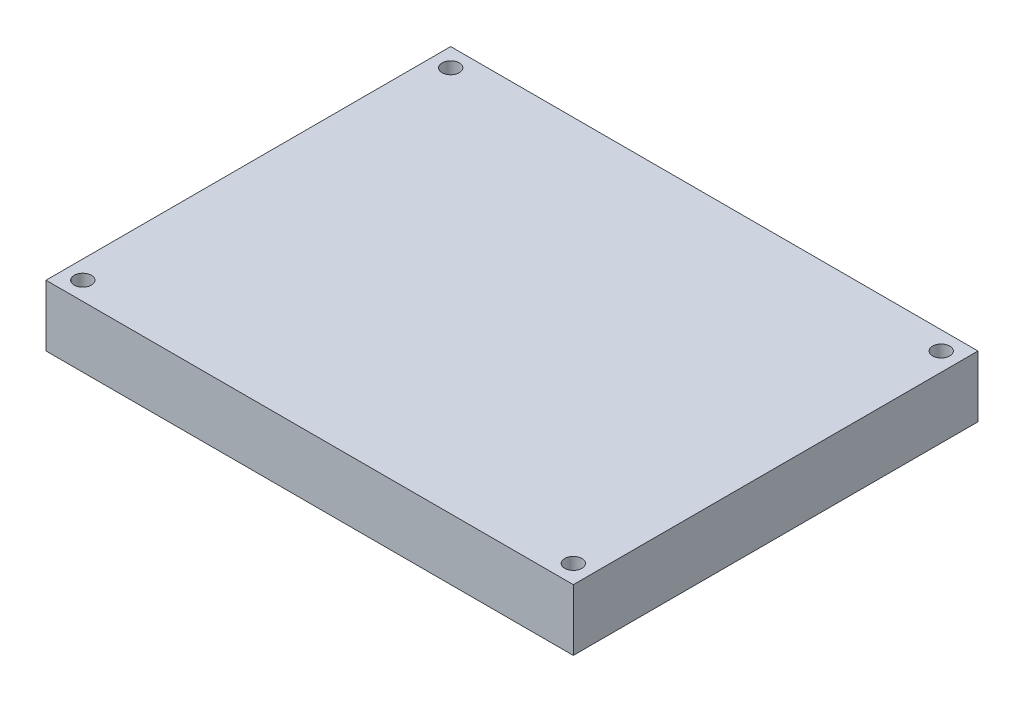
ISO-10303-21;
HEADER;
FILE_DESCRIPTION(('STEP AP214'),'2;1');
FILE_NAME('part.step','',(''),(''),'','','');
FILE_SCHEMA(('AUTOMOTIVE_DESIGN { 1 0 10303 214 1 1 1 1 }'));
ENDSEC;
DATA;
#1=APPLICATION_CONTEXT('core data for automotive mechanical design processes');
#2=APPLICATION_PROTOCOL_DEFINITION('international standard','automotive_design',2000,#1);
#3=PRODUCT_CONTEXT('',#1,'mechanical');
#4=PRODUCT('Part','Part','',(#3));
#5=PRODUCT_RELATED_PRODUCT_CATEGORY('part','',(#4));
#6=PRODUCT_DEFINITION_FORMATION('','',#4);
#7=PRODUCT_DEFINITION_CONTEXT('part definition',#1,'design');
#8=PRODUCT_DEFINITION('design','',#6,#7);
#9=PRODUCT_DEFINITION_SHAPE('','',#8);
#10=(LENGTH_UNIT() NAMED_UNIT(*) SI_UNIT(.MILLI.,.METRE.));
#11=(NAMED_UNIT(*) PLANE_ANGLE_UNIT() SI_UNIT($,.RADIAN.));
#12=(NAMED_UNIT(*) SI_UNIT($,.STERADIAN.) SOLID_ANGLE_UNIT());
#13=UNCERTAINTY_MEASURE_WITH_UNIT(LENGTH_MEASURE(1.E-05),#10,'distance_accuracy_value','');
#14=(GEOMETRIC_REPRESENTATION_CONTEXT(3) GLOBAL_UNCERTAINTY_ASSIGNED_CONTEXT((#13)) GLOBAL_UNIT_ASSIGNED_CONTEXT((#10,
#11,#12)) REPRESENTATION_CONTEXT('',''));
#15=CARTESIAN_POINT('',(0.,0.,0.));
#16=DIRECTION('',(0.,0.,1.));
#17=DIRECTION('',(1.,0.,0.));
#18=AXIS2_PLACEMENT_3D('',#15,#16,#17);
#19=CARTESIAN_POINT('',(43.,10.,-33.));
#20=DIRECTION('',(-1.,0.,0.));
#21=DIRECTION('',(0.,0.,1.));
#22=AXIS2_PLACEMENT_3D('',#19,#20,#21);
#23=PLANE('',#22);
#24=DIRECTION('',(0.,0.,-1.));
#25=VECTOR('',#24,1.);
#26=CARTESIAN_POINT('',(43.,0.,-33.));
#27=LINE('',#26,#25);
#28=CARTESIAN_POINT('',(43.,0.,33.));
#29=VERTEX_POINT('',#28);
#30=CARTESIAN_POINT('',(43.,0.,-33.));
#31=VERTEX_POINT('',#30);
#32=EDGE_CURVE('E97',#29,#31,#27,.T.);
#33=ORIENTED_EDGE('',*,*,#32,.T.);
#34=DIRECTION('',(0.,-1.,0.));
#35=VECTOR('',#34,1.);
#36=CARTESIAN_POINT('',(43.,10.,-33.));
#37=LINE('',#36,#35);
#38=CARTESIAN_POINT('',(43.,10.,-33.));
#39=VERTEX_POINT('',#38);
#40=EDGE_CURVE('E11',#39,#31,#37,.T.);
#41=ORIENTED_EDGE('',*,*,#40,.F.);
#42=DIRECTION('',(0.,0.,-1.));
#43=VECTOR('',#42,1.);
#44=CARTESIAN_POINT('',(43.,10.,-33.));
#45=LINE('',#44,#43);
#46=CARTESIAN_POINT('',(43.,10.,33.));
#47=VERTEX_POINT('',#46);
#48=EDGE_CURVE('E85',#47,#39,#45,.T.);
#49=ORIENTED_EDGE('',*,*,#48,.F.);
#50=DIRECTION('',(0.,-1.,0.));
#51=VECTOR('',#50,1.);
#52=CARTESIAN_POINT('',(43.,10.,33.));
#53=LINE('',#52,#51);
#54=EDGE_CURVE('E93',#47,#29,#53,.T.);
#55=ORIENTED_EDGE('',*,*,#54,.T.);
#56=EDGE_LOOP('',(#33,#41,#49,#55));
#57=FACE_BOUND('',#56,.T.);
#58=ADVANCED_FACE('F34',(#57),#23,.F.);
#59=CARTESIAN_POINT('',(-43.,10.,-33.));
#60=DIRECTION('',(0.,0.,1.));
#61=DIRECTION('',(1.,0.,0.));
#62=AXIS2_PLACEMENT_3D('',#59,#60,#61);
#63=PLANE('',#62);
#64=DIRECTION('',(-1.,0.,0.));
#65=VECTOR('',#64,1.);
#66=CARTESIAN_POINT('',(-43.,0.,-33.));
#67=LINE('',#66,#65);
#68=CARTESIAN_POINT('',(-43.,0.,-33.));
#69=VERTEX_POINT('',#68);
#70=EDGE_CURVE('E89',#31,#69,#67,.T.);
#71=ORIENTED_EDGE('',*,*,#70,.T.);
#72=DIRECTION('',(0.,-1.,0.));
#73=VECTOR('',#72,1.);
#74=CARTESIAN_POINT('',(-43.,10.,-33.));
#75=LINE('',#74,#73);
#76=CARTESIAN_POINT('',(-43.,10.,-33.));
#77=VERTEX_POINT('',#76);
#78=EDGE_CURVE('E42',#77,#69,#75,.T.);
#79=ORIENTED_EDGE('',*,*,#78,.F.);
#80=DIRECTION('',(-1.,0.,0.));
#81=VECTOR('',#80,1.);
#82=CARTESIAN_POINT('',(-43.,10.,-33.));
#83=LINE('',#82,#81);
#84=EDGE_CURVE('E80',#39,#77,#83,.T.);
#85=ORIENTED_EDGE('',*,*,#84,.F.);
#86=ORIENTED_EDGE('',*,*,#40,.T.);
#87=EDGE_LOOP('',(#71,#79,#85,#86));
#88=FACE_BOUND('',#87,.T.);
#89=ADVANCED_FACE('F88',(#88),#63,.F.);
#90=CARTESIAN_POINT('',(-43.,10.,-33.));
#91=DIRECTION('',(1.,0.,0.));
#92=DIRECTION('',(0.,0.,-1.));
#93=AXIS2_PLACEMENT_3D('',#90,#91,#92);
#94=PLANE('',#93);
#95=DIRECTION('',(0.,0.,1.));
#96=VECTOR('',#95,1.);
#97=CARTESIAN_POINT('',(-43.,0.,-33.));
#98=LINE('',#97,#96);
#99=CARTESIAN_POINT('',(-43.,0.,33.));
#100=VERTEX_POINT('',#99);
#101=EDGE_CURVE('E67',#69,#100,#98,.T.);
#102=ORIENTED_EDGE('',*,*,#101,.T.);
#103=DIRECTION('',(0.,-1.,0.));
#104=VECTOR('',#103,1.);
#105=CARTESIAN_POINT('',(-43.,10.,33.));
#106=LINE('',#105,#104);
#107=CARTESIAN_POINT('',(-43.,10.,33.));
#108=VERTEX_POINT('',#107);
#109=EDGE_CURVE('E90',#108,#100,#106,.T.);
#110=ORIENTED_EDGE('',*,*,#109,.F.);
#111=DIRECTION('',(0.,0.,1.));
#112=VECTOR('',#111,1.);
#113=CARTESIAN_POINT('',(-43.,10.,-33.));
#114=LINE('',#113,#112);
#115=EDGE_CURVE('E83',#77,#108,#114,.T.);
#116=ORIENTED_EDGE('',*,*,#115,.F.);
#117=ORIENTED_EDGE('',*,*,#78,.T.);
#118=EDGE_LOOP('',(#102,#110,#116,#117));
#119=FACE_BOUND('',#118,.T.);
#120=ADVANCED_FACE('F91',(#119),#94,.F.);
#121=CARTESIAN_POINT('',(-43.,10.,33.));
#122=DIRECTION('',(0.,0.,-1.));
#123=DIRECTION('',(-1.,0.,0.));
#124=AXIS2_PLACEMENT_3D('',#121,#122,#123);
#125=PLANE('',#124);
#126=DIRECTION('',(1.,0.,0.));
#127=VECTOR('',#126,1.);
#128=CARTESIAN_POINT('',(-43.,0.,33.));
#129=LINE('',#128,#127);
#130=EDGE_CURVE('E73',#100,#29,#129,.T.);
#131=ORIENTED_EDGE('',*,*,#130,.T.);
#132=ORIENTED_EDGE('',*,*,#54,.F.);
#133=DIRECTION('',(1.,0.,0.));
#134=VECTOR('',#133,1.);
#135=CARTESIAN_POINT('',(-43.,10.,33.));
#136=LINE('',#135,#134);
#137=EDGE_CURVE('E50',#108,#47,#136,.T.);
#138=ORIENTED_EDGE('',*,*,#137,.F.);
#139=ORIENTED_EDGE('',*,*,#109,.T.);
#140=EDGE_LOOP('',(#131,#132,#138,#139));
#141=FACE_BOUND('',#140,.T.);
#142=ADVANCED_FACE('F105',(#141),#125,.F.);
#143=CARTESIAN_POINT('',(0.,10.,0.));
#144=DIRECTION('',(0.,1.,0.));
#145=DIRECTION('',(0.,0.,1.));
#146=AXIS2_PLACEMENT_3D('',#143,#144,#145);
#147=PLANE('',#146);
#148=CARTESIAN_POINT('',(40.,10.,-30.));
#149=DIRECTION('',(0.,1.,0.));
#150=DIRECTION('',(0.,0.,-1.));
#151=AXIS2_PLACEMENT_3D('',#148,#149,#150);
#152=CIRCLE('',#151,1.4);
#153=CARTESIAN_POINT('',(40.,10.,-31.4));
#154=VERTEX_POINT('',#153);
#155=EDGE_CURVE('E129',#154,#154,#152,.T.);
#156=ORIENTED_EDGE('',*,*,#155,.F.);
#157=EDGE_LOOP('',(#156));
#158=FACE_BOUND('',#157,.T.);
#159=CARTESIAN_POINT('',(40.,10.,30.));
#160=DIRECTION('',(0.,1.,0.));
#161=DIRECTION('',(0.,0.,1.));
#162=AXIS2_PLACEMENT_3D('',#159,#160,#161);
#163=CIRCLE('',#162,1.4);
#164=CARTESIAN_POINT('',(40.,10.,31.4));
#165=VERTEX_POINT('',#164);
#166=EDGE_CURVE('E123',#165,#165,#163,.T.);
#167=ORIENTED_EDGE('',*,*,#166,.F.);
#168=EDGE_LOOP('',(#167));
#169=FACE_BOUND('',#168,.T.);
#170=CARTESIAN_POINT('',(-40.,10.,30.));
#171=DIRECTION('',(0.,1.,0.));
#172=DIRECTION('',(0.,0.,-1.));
#173=AXIS2_PLACEMENT_3D('',#170,#171,#172);
#174=CIRCLE('',#173,1.39999999999999);
#175=CARTESIAN_POINT('',(-40.,10.,28.6));
#176=VERTEX_POINT('',#175);
#177=EDGE_CURVE('E117',#176,#176,#174,.T.);
#178=ORIENTED_EDGE('',*,*,#177,.F.);
#179=EDGE_LOOP('',(#178));
#180=FACE_BOUND('',#179,.T.);
#181=CARTESIAN_POINT('',(-40.,10.,-30.));
#182=DIRECTION('',(0.,1.,0.));
#183=DIRECTION('',(0.,0.,1.));
#184=AXIS2_PLACEMENT_3D('',#181,#182,#183);
#185=CIRCLE('',#184,1.4);
#186=CARTESIAN_POINT('',(-40.,10.,-28.6));
#187=VERTEX_POINT('',#186);
#188=EDGE_CURVE('E111',#187,#187,#185,.T.);
#189=ORIENTED_EDGE('',*,*,#188,.F.);
#190=EDGE_LOOP('',(#189));
#191=FACE_BOUND('',#190,.T.);
#192=ORIENTED_EDGE('',*,*,#48,.T.);
#193=ORIENTED_EDGE('',*,*,#84,.T.);
#194=ORIENTED_EDGE('',*,*,#115,.T.);
#195=ORIENTED_EDGE('',*,*,#137,.T.);
#196=EDGE_LOOP('',(#192,#193,#194,#195));
#197=FACE_BOUND('',#196,.T.);
#198=ADVANCED_FACE('F81',(#158,#169,#180,#191,#197),#147,.T.);
#199=CARTESIAN_POINT('',(0.,0.,0.));
#200=DIRECTION('',(0.,1.,0.));
#201=DIRECTION('',(0.,0.,1.));
#202=AXIS2_PLACEMENT_3D('',#199,#200,#201);
#203=PLANE('',#202);
#204=CARTESIAN_POINT('',(40.,0.,-30.));
#205=DIRECTION('',(0.,1.,0.));
#206=DIRECTION('',(0.,0.,-1.));
#207=AXIS2_PLACEMENT_3D('',#204,#205,#206);
#208=CIRCLE('',#207,1.4);
#209=CARTESIAN_POINT('',(40.,0.,-31.4));
#210=VERTEX_POINT('',#209);
#211=EDGE_CURVE('E114',#210,#210,#208,.T.);
#212=ORIENTED_EDGE('',*,*,#211,.T.);
#213=EDGE_LOOP('',(#212));
#214=FACE_BOUND('',#213,.T.);
#215=CARTESIAN_POINT('',(40.,0.,30.));
#216=DIRECTION('',(0.,1.,0.));
#217=DIRECTION('',(0.,0.,1.));
#218=AXIS2_PLACEMENT_3D('',#215,#216,#217);
#219=CIRCLE('',#218,1.4);
#220=CARTESIAN_POINT('',(40.,0.,31.4));
#221=VERTEX_POINT('',#220);
#222=EDGE_CURVE('E126',#221,#221,#219,.T.);
#223=ORIENTED_EDGE('',*,*,#222,.T.);
#224=EDGE_LOOP('',(#223));
#225=FACE_BOUND('',#224,.T.);
#226=CARTESIAN_POINT('',(-40.,0.,30.));
#227=DIRECTION('',(0.,1.,0.));
#228=DIRECTION('',(0.,0.,-1.));
#229=AXIS2_PLACEMENT_3D('',#226,#227,#228);
#230=CIRCLE('',#229,1.39999999999999);
#231=CARTESIAN_POINT('',(-40.,0.,28.6));
#232=VERTEX_POINT('',#231);
#233=EDGE_CURVE('E120',#232,#232,#230,.T.);
#234=ORIENTED_EDGE('',*,*,#233,.T.);
#235=EDGE_LOOP('',(#234));
#236=FACE_BOUND('',#235,.T.);
#237=CARTESIAN_POINT('',(-40.,0.,-30.));
#238=DIRECTION('',(0.,1.,0.));
#239=DIRECTION('',(0.,0.,1.));
#240=AXIS2_PLACEMENT_3D('',#237,#238,#239);
#241=CIRCLE('',#240,1.4);
#242=CARTESIAN_POINT('',(-40.,0.,-28.6));
#243=VERTEX_POINT('',#242);
#244=EDGE_CURVE('E100',#243,#243,#241,.T.);
#245=ORIENTED_EDGE('',*,*,#244,.T.);
#246=EDGE_LOOP('',(#245));
#247=FACE_BOUND('',#246,.T.);
#248=ORIENTED_EDGE('',*,*,#32,.F.);
#249=ORIENTED_EDGE('',*,*,#130,.F.);
#250=ORIENTED_EDGE('',*,*,#101,.F.);
#251=ORIENTED_EDGE('',*,*,#70,.F.);
#252=EDGE_LOOP('',(#248,#249,#250,#251));
#253=FACE_BOUND('',#252,.T.);
#254=ADVANCED_FACE('F108',(#214,#225,#236,#247,#253),#203,.F.);
#255=CARTESIAN_POINT('',(-40.,0.,-30.));
#256=DIRECTION('',(0.,1.,0.));
#257=DIRECTION('',(0.,0.,1.));
#258=AXIS2_PLACEMENT_3D('',#255,#256,#257);
#259=CYLINDRICAL_SURFACE('',#258,1.4);
#260=ORIENTED_EDGE('',*,*,#244,.F.);
#261=EDGE_LOOP('',(#260));
#262=FACE_BOUND('',#261,.T.);
#263=ORIENTED_EDGE('',*,*,#188,.T.);
#264=EDGE_LOOP('',(#263));
#265=FACE_BOUND('',#264,.T.);
#266=ADVANCED_FACE('F153',(#262,#265),#259,.F.);
#267=CARTESIAN_POINT('',(-40.,0.,30.));
#268=DIRECTION('',(0.,1.,0.));
#269=DIRECTION('',(0.,0.,1.));
#270=AXIS2_PLACEMENT_3D('',#267,#268,#269);
#271=CYLINDRICAL_SURFACE('',#270,1.39999999999999);
#272=ORIENTED_EDGE('',*,*,#233,.F.);
#273=EDGE_LOOP('',(#272));
#274=FACE_BOUND('',#273,.T.);
#275=ORIENTED_EDGE('',*,*,#177,.T.);
#276=EDGE_LOOP('',(#275));
#277=FACE_BOUND('',#276,.T.);
#278=ADVANCED_FACE('F155',(#274,#277),#271,.F.);
#279=CARTESIAN_POINT('',(40.,0.,30.));
#280=DIRECTION('',(0.,1.,0.));
#281=DIRECTION('',(0.,0.,1.));
#282=AXIS2_PLACEMENT_3D('',#279,#280,#281);
#283=CYLINDRICAL_SURFACE('',#282,1.4);
#284=ORIENTED_EDGE('',*,*,#222,.F.);
#285=EDGE_LOOP('',(#284));
#286=FACE_BOUND('',#285,.T.);
#287=ORIENTED_EDGE('',*,*,#166,.T.);
#288=EDGE_LOOP('',(#287));
#289=FACE_BOUND('',#288,.T.);
#290=ADVANCED_FACE('F140',(#286,#289),#283,.F.);
#291=CARTESIAN_POINT('',(40.,0.,-30.));
#292=DIRECTION('',(0.,1.,0.));
#293=DIRECTION('',(0.,0.,1.));
#294=AXIS2_PLACEMENT_3D('',#291,#292,#293);
#295=CYLINDRICAL_SURFACE('',#294,1.4);
#296=ORIENTED_EDGE('',*,*,#211,.F.);
#297=EDGE_LOOP('',(#296));
#298=FACE_BOUND('',#297,.T.);
#299=ORIENTED_EDGE('',*,*,#155,.T.);
#300=EDGE_LOOP('',(#299));
#301=FACE_BOUND('',#300,.T.);
#302=ADVANCED_FACE('F137',(#298,#301),#295,.F.);
#303=CLOSED_SHELL('',(#58,#89,#120,#142,#198,#254,#266,#278,#290,#302));
#304=MANIFOLD_SOLID_BREP('B2',#303);
#305=ADVANCED_BREP_SHAPE_REPRESENTATION('',(#18,#304),#14);
#306=SHAPE_DEFINITION_REPRESENTATION(#9,#305);
ENDSEC;
END-ISO-10303-21;
